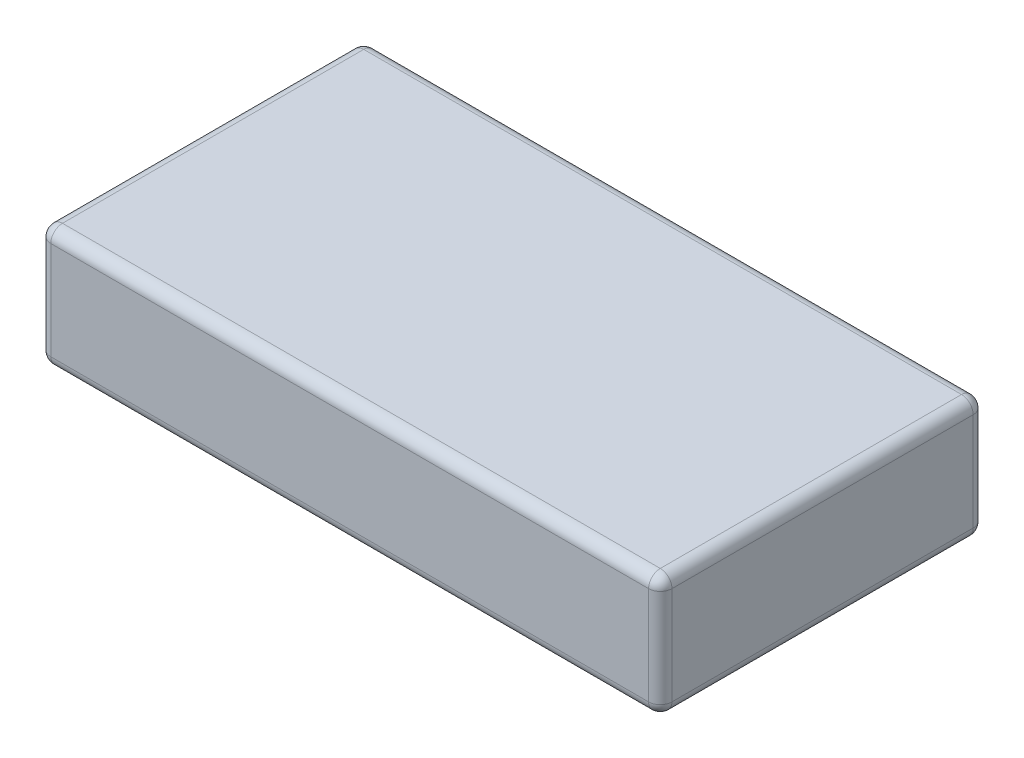
ISO-10303-21;
HEADER;
FILE_DESCRIPTION(('STEP AP214'),'2;1');
FILE_NAME('part.step','',(''),(''),'','','');
FILE_SCHEMA(('AUTOMOTIVE_DESIGN { 1 0 10303 214 1 1 1 1 }'));
ENDSEC;
DATA;
#1=APPLICATION_CONTEXT('core data for automotive mechanical design processes');
#2=APPLICATION_PROTOCOL_DEFINITION('international standard','automotive_design',2000,#1);
#3=PRODUCT_CONTEXT('',#1,'mechanical');
#4=PRODUCT('Part','Part','',(#3));
#5=PRODUCT_RELATED_PRODUCT_CATEGORY('part','',(#4));
#6=PRODUCT_DEFINITION_FORMATION('','',#4);
#7=PRODUCT_DEFINITION_CONTEXT('part definition',#1,'design');
#8=PRODUCT_DEFINITION('design','',#6,#7);
#9=PRODUCT_DEFINITION_SHAPE('','',#8);
#10=(LENGTH_UNIT() NAMED_UNIT(*) SI_UNIT(.MILLI.,.METRE.));
#11=(NAMED_UNIT(*) PLANE_ANGLE_UNIT() SI_UNIT($,.RADIAN.));
#12=(NAMED_UNIT(*) SI_UNIT($,.STERADIAN.) SOLID_ANGLE_UNIT());
#13=UNCERTAINTY_MEASURE_WITH_UNIT(LENGTH_MEASURE(1.E-05),#10,'distance_accuracy_value','');
#14=(GEOMETRIC_REPRESENTATION_CONTEXT(3) GLOBAL_UNCERTAINTY_ASSIGNED_CONTEXT((#13)) GLOBAL_UNIT_ASSIGNED_CONTEXT((#10,
#11,#12)) REPRESENTATION_CONTEXT('',''));
#15=CARTESIAN_POINT('',(0.,0.,0.));
#16=DIRECTION('',(0.,0.,1.));
#17=DIRECTION('',(1.,0.,0.));
#18=AXIS2_PLACEMENT_3D('',#15,#16,#17);
#19=CARTESIAN_POINT('',(26.6,10.4,13.9));
#20=DIRECTION('',(-1.,0.,0.));
#21=DIRECTION('',(0.,0.,1.));
#22=AXIS2_PLACEMENT_3D('',#19,#20,#21);
#23=PLANE('',#22);
#24=DIRECTION('',(0.,0.,-1.));
#25=VECTOR('',#24,1.);
#26=CARTESIAN_POINT('',(26.6,1.,-13.9));
#27=LINE('',#26,#25);
#28=CARTESIAN_POINT('',(26.6,1.,12.9));
#29=VERTEX_POINT('',#28);
#30=CARTESIAN_POINT('',(26.6,1.,-12.9));
#31=VERTEX_POINT('',#30);
#32=EDGE_CURVE('E226',#29,#31,#27,.T.);
#33=ORIENTED_EDGE('',*,*,#32,.T.);
#34=DIRECTION('',(0.,-1.,0.));
#35=VECTOR('',#34,1.);
#36=CARTESIAN_POINT('',(26.6,10.4,-12.9));
#37=LINE('',#36,#35);
#38=CARTESIAN_POINT('',(26.6,9.4,-12.9));
#39=VERTEX_POINT('',#38);
#40=EDGE_CURVE('E230',#31,#39,#37,.F.);
#41=ORIENTED_EDGE('',*,*,#40,.T.);
#42=DIRECTION('',(0.,0.,-1.));
#43=VECTOR('',#42,1.);
#44=CARTESIAN_POINT('',(26.6,9.4,13.9));
#45=LINE('',#44,#43);
#46=CARTESIAN_POINT('',(26.6,9.4,12.9));
#47=VERTEX_POINT('',#46);
#48=EDGE_CURVE('E223',#39,#47,#45,.F.);
#49=ORIENTED_EDGE('',*,*,#48,.T.);
#50=DIRECTION('',(0.,-1.,0.));
#51=VECTOR('',#50,1.);
#52=CARTESIAN_POINT('',(26.6,10.4,12.9));
#53=LINE('',#52,#51);
#54=EDGE_CURVE('E220',#47,#29,#53,.T.);
#55=ORIENTED_EDGE('',*,*,#54,.T.);
#56=EDGE_LOOP('',(#33,#41,#49,#55));
#57=FACE_BOUND('',#56,.T.);
#58=ADVANCED_FACE('F45',(#57),#23,.F.);
#59=CARTESIAN_POINT('',(-26.6,10.4,-13.9));
#60=DIRECTION('',(0.,0.,1.));
#61=DIRECTION('',(1.,0.,0.));
#62=AXIS2_PLACEMENT_3D('',#59,#60,#61);
#63=PLANE('',#62);
#64=DIRECTION('',(-1.,0.,0.));
#65=VECTOR('',#64,1.);
#66=CARTESIAN_POINT('',(-26.6,1.,-13.9));
#67=LINE('',#66,#65);
#68=CARTESIAN_POINT('',(25.6,1.,-13.9));
#69=VERTEX_POINT('',#68);
#70=CARTESIAN_POINT('',(-25.6,1.,-13.9));
#71=VERTEX_POINT('',#70);
#72=EDGE_CURVE('E146',#69,#71,#67,.T.);
#73=ORIENTED_EDGE('',*,*,#72,.T.);
#74=DIRECTION('',(0.,-1.,0.));
#75=VECTOR('',#74,1.);
#76=CARTESIAN_POINT('',(-25.6,10.4,-13.9));
#77=LINE('',#76,#75);
#78=CARTESIAN_POINT('',(-25.6,9.4,-13.9));
#79=VERTEX_POINT('',#78);
#80=EDGE_CURVE('E141',#71,#79,#77,.F.);
#81=ORIENTED_EDGE('',*,*,#80,.T.);
#82=DIRECTION('',(-1.,0.,0.));
#83=VECTOR('',#82,1.);
#84=CARTESIAN_POINT('',(-26.6,9.4,-13.9));
#85=LINE('',#84,#83);
#86=CARTESIAN_POINT('',(25.6,9.4,-13.9));
#87=VERTEX_POINT('',#86);
#88=EDGE_CURVE('E133',#79,#87,#85,.F.);
#89=ORIENTED_EDGE('',*,*,#88,.T.);
#90=DIRECTION('',(0.,-1.,0.));
#91=VECTOR('',#90,1.);
#92=CARTESIAN_POINT('',(25.6,10.4,-13.9));
#93=LINE('',#92,#91);
#94=EDGE_CURVE('E138',#87,#69,#93,.T.);
#95=ORIENTED_EDGE('',*,*,#94,.T.);
#96=EDGE_LOOP('',(#73,#81,#89,#95));
#97=FACE_BOUND('',#96,.T.);
#98=ADVANCED_FACE('F136',(#97),#63,.F.);
#99=CARTESIAN_POINT('',(-26.6,10.4,13.9));
#100=DIRECTION('',(1.,0.,0.));
#101=DIRECTION('',(0.,0.,-1.));
#102=AXIS2_PLACEMENT_3D('',#99,#100,#101);
#103=PLANE('',#102);
#104=DIRECTION('',(0.,0.,1.));
#105=VECTOR('',#104,1.);
#106=CARTESIAN_POINT('',(-26.6,1.,13.9));
#107=LINE('',#106,#105);
#108=CARTESIAN_POINT('',(-26.6,1.,-12.9));
#109=VERTEX_POINT('',#108);
#110=CARTESIAN_POINT('',(-26.6,1.,12.9));
#111=VERTEX_POINT('',#110);
#112=EDGE_CURVE('E200',#109,#111,#107,.T.);
#113=ORIENTED_EDGE('',*,*,#112,.T.);
#114=DIRECTION('',(0.,-1.,0.));
#115=VECTOR('',#114,1.);
#116=CARTESIAN_POINT('',(-26.6,10.4,12.9));
#117=LINE('',#116,#115);
#118=CARTESIAN_POINT('',(-26.6,9.4,12.9));
#119=VERTEX_POINT('',#118);
#120=EDGE_CURVE('E204',#111,#119,#117,.F.);
#121=ORIENTED_EDGE('',*,*,#120,.T.);
#122=DIRECTION('',(0.,0.,1.));
#123=VECTOR('',#122,1.);
#124=CARTESIAN_POINT('',(-26.6,9.4,13.9));
#125=LINE('',#124,#123);
#126=CARTESIAN_POINT('',(-26.6,9.4,-12.9));
#127=VERTEX_POINT('',#126);
#128=EDGE_CURVE('E197',#119,#127,#125,.F.);
#129=ORIENTED_EDGE('',*,*,#128,.T.);
#130=DIRECTION('',(0.,-1.,0.));
#131=VECTOR('',#130,1.);
#132=CARTESIAN_POINT('',(-26.6,10.4,-12.9));
#133=LINE('',#132,#131);
#134=EDGE_CURVE('E194',#127,#109,#133,.T.);
#135=ORIENTED_EDGE('',*,*,#134,.T.);
#136=EDGE_LOOP('',(#113,#121,#129,#135));
#137=FACE_BOUND('',#136,.T.);
#138=ADVANCED_FACE('F323',(#137),#103,.F.);
#139=CARTESIAN_POINT('',(-26.6,10.4,13.9));
#140=DIRECTION('',(0.,0.,-1.));
#141=DIRECTION('',(-1.,0.,0.));
#142=AXIS2_PLACEMENT_3D('',#139,#140,#141);
#143=PLANE('',#142);
#144=DIRECTION('',(1.,0.,0.));
#145=VECTOR('',#144,1.);
#146=CARTESIAN_POINT('',(-26.6,9.4,13.9));
#147=LINE('',#146,#145);
#148=CARTESIAN_POINT('',(25.6,9.4,13.9));
#149=VERTEX_POINT('',#148);
#150=CARTESIAN_POINT('',(-25.6,9.4,13.9));
#151=VERTEX_POINT('',#150);
#152=EDGE_CURVE('E210',#149,#151,#147,.F.);
#153=ORIENTED_EDGE('',*,*,#152,.T.);
#154=DIRECTION('',(0.,-1.,0.));
#155=VECTOR('',#154,1.);
#156=CARTESIAN_POINT('',(-25.6,10.4,13.9));
#157=LINE('',#156,#155);
#158=CARTESIAN_POINT('',(-25.6,1.,13.9));
#159=VERTEX_POINT('',#158);
#160=EDGE_CURVE('E217',#151,#159,#157,.T.);
#161=ORIENTED_EDGE('',*,*,#160,.T.);
#162=DIRECTION('',(1.,0.,0.));
#163=VECTOR('',#162,1.);
#164=CARTESIAN_POINT('',(26.6,1.,13.9));
#165=LINE('',#164,#163);
#166=CARTESIAN_POINT('',(25.6,1.,13.9));
#167=VERTEX_POINT('',#166);
#168=EDGE_CURVE('E213',#159,#167,#165,.T.);
#169=ORIENTED_EDGE('',*,*,#168,.T.);
#170=DIRECTION('',(0.,-1.,0.));
#171=VECTOR('',#170,1.);
#172=CARTESIAN_POINT('',(25.6,10.4,13.9));
#173=LINE('',#172,#171);
#174=EDGE_CURVE('E207',#167,#149,#173,.F.);
#175=ORIENTED_EDGE('',*,*,#174,.T.);
#176=EDGE_LOOP('',(#153,#161,#169,#175));
#177=FACE_BOUND('',#176,.T.);
#178=ADVANCED_FACE('F332',(#177),#143,.F.);
#179=CARTESIAN_POINT('',(0.,10.4,0.));
#180=DIRECTION('',(0.,-1.,0.));
#181=DIRECTION('',(0.,0.,-1.));
#182=AXIS2_PLACEMENT_3D('',#179,#180,#181);
#183=PLANE('',#182);
#184=DIRECTION('',(0.,0.,1.));
#185=VECTOR('',#184,1.);
#186=CARTESIAN_POINT('',(-25.6,10.4,0.));
#187=LINE('',#186,#185);
#188=CARTESIAN_POINT('',(-25.6,10.4,-12.9));
#189=VERTEX_POINT('',#188);
#190=CARTESIAN_POINT('',(-25.6,10.4,12.9));
#191=VERTEX_POINT('',#190);
#192=EDGE_CURVE('E55',#189,#191,#187,.T.);
#193=ORIENTED_EDGE('',*,*,#192,.T.);
#194=DIRECTION('',(1.,0.,0.));
#195=VECTOR('',#194,1.);
#196=CARTESIAN_POINT('',(0.,10.4,12.9));
#197=LINE('',#196,#195);
#198=CARTESIAN_POINT('',(25.6,10.4,12.9));
#199=VERTEX_POINT('',#198);
#200=EDGE_CURVE('E11',#191,#199,#197,.T.);
#201=ORIENTED_EDGE('',*,*,#200,.T.);
#202=DIRECTION('',(0.,0.,-1.));
#203=VECTOR('',#202,1.);
#204=CARTESIAN_POINT('',(25.6,10.4,0.));
#205=LINE('',#204,#203);
#206=CARTESIAN_POINT('',(25.6,10.4,-12.9));
#207=VERTEX_POINT('',#206);
#208=EDGE_CURVE('E233',#199,#207,#205,.T.);
#209=ORIENTED_EDGE('',*,*,#208,.T.);
#210=DIRECTION('',(-1.,0.,0.));
#211=VECTOR('',#210,1.);
#212=CARTESIAN_POINT('',(0.,10.4,-12.9));
#213=LINE('',#212,#211);
#214=EDGE_CURVE('E66',#207,#189,#213,.T.);
#215=ORIENTED_EDGE('',*,*,#214,.T.);
#216=EDGE_LOOP('',(#193,#201,#209,#215));
#217=FACE_BOUND('',#216,.T.);
#218=ADVANCED_FACE('F354',(#217),#183,.F.);
#219=CARTESIAN_POINT('',(0.,0.,0.));
#220=DIRECTION('',(0.,-1.,0.));
#221=DIRECTION('',(0.,0.,-1.));
#222=AXIS2_PLACEMENT_3D('',#219,#220,#221);
#223=PLANE('',#222);
#224=DIRECTION('',(0.,0.,1.));
#225=VECTOR('',#224,1.);
#226=CARTESIAN_POINT('',(-25.6,0.,-13.9));
#227=LINE('',#226,#225);
#228=CARTESIAN_POINT('',(-25.6,0.,12.9));
#229=VERTEX_POINT('',#228);
#230=CARTESIAN_POINT('',(-25.6,0.,-12.9));
#231=VERTEX_POINT('',#230);
#232=EDGE_CURVE('E187',#229,#231,#227,.F.);
#233=ORIENTED_EDGE('',*,*,#232,.T.);
#234=DIRECTION('',(-1.,0.,0.));
#235=VECTOR('',#234,1.);
#236=CARTESIAN_POINT('',(26.6,0.,-12.9));
#237=LINE('',#236,#235);
#238=CARTESIAN_POINT('',(25.6,0.,-12.9));
#239=VERTEX_POINT('',#238);
#240=EDGE_CURVE('E190',#231,#239,#237,.F.);
#241=ORIENTED_EDGE('',*,*,#240,.T.);
#242=DIRECTION('',(0.,0.,-1.));
#243=VECTOR('',#242,1.);
#244=CARTESIAN_POINT('',(25.6,0.,13.9));
#245=LINE('',#244,#243);
#246=CARTESIAN_POINT('',(25.6,0.,12.9));
#247=VERTEX_POINT('',#246);
#248=EDGE_CURVE('E181',#239,#247,#245,.F.);
#249=ORIENTED_EDGE('',*,*,#248,.T.);
#250=DIRECTION('',(1.,0.,0.));
#251=VECTOR('',#250,1.);
#252=CARTESIAN_POINT('',(-26.6,0.,12.9));
#253=LINE('',#252,#251);
#254=EDGE_CURVE('E184',#247,#229,#253,.F.);
#255=ORIENTED_EDGE('',*,*,#254,.T.);
#256=EDGE_LOOP('',(#233,#241,#249,#255));
#257=FACE_BOUND('',#256,.T.);
#258=ADVANCED_FACE('F356',(#257),#223,.T.);
#259=CARTESIAN_POINT('',(0.,9.4,12.9));
#260=DIRECTION('',(1.,0.,0.));
#261=DIRECTION('',(0.,0.,-1.));
#262=AXIS2_PLACEMENT_3D('',#259,#260,#261);
#263=CYLINDRICAL_SURFACE('',#262,1.);
#264=CARTESIAN_POINT('',(25.6,9.4,12.9));
#265=DIRECTION('',(1.,0.,0.));
#266=DIRECTION('',(0.,0.,-1.));
#267=AXIS2_PLACEMENT_3D('',#264,#265,#266);
#268=CIRCLE('',#267,1.);
#269=EDGE_CURVE('E49',#199,#149,#268,.T.);
#270=ORIENTED_EDGE('',*,*,#269,.F.);
#271=ORIENTED_EDGE('',*,*,#200,.F.);
#272=CARTESIAN_POINT('',(-25.6,9.4,12.9));
#273=DIRECTION('',(-1.,0.,0.));
#274=DIRECTION('',(0.,0.,1.));
#275=AXIS2_PLACEMENT_3D('',#272,#273,#274);
#276=CIRCLE('',#275,1.);
#277=EDGE_CURVE('E175',#151,#191,#276,.T.);
#278=ORIENTED_EDGE('',*,*,#277,.F.);
#279=ORIENTED_EDGE('',*,*,#152,.F.);
#280=EDGE_LOOP('',(#270,#271,#278,#279));
#281=FACE_BOUND('',#280,.T.);
#282=ADVANCED_FACE('F47',(#281),#263,.T.);
#283=CARTESIAN_POINT('',(25.6,9.4,12.9));
#284=DIRECTION('',(0.,0.,1.));
#285=DIRECTION('',(1.,0.,0.));
#286=AXIS2_PLACEMENT_3D('',#283,#284,#285);
#287=SPHERICAL_SURFACE('',#286,1.);
#288=CARTESIAN_POINT('',(25.6,9.4,12.9));
#289=DIRECTION('',(0.,0.,1.));
#290=DIRECTION('',(1.,0.,0.));
#291=AXIS2_PLACEMENT_3D('',#288,#289,#290);
#292=CIRCLE('',#291,1.);
#293=EDGE_CURVE('E300',#199,#47,#292,.F.);
#294=ORIENTED_EDGE('',*,*,#293,.F.);
#295=ORIENTED_EDGE('',*,*,#269,.T.);
#296=CARTESIAN_POINT('',(25.6,9.4,12.9));
#297=DIRECTION('',(0.,1.,0.));
#298=DIRECTION('',(0.,0.,1.));
#299=AXIS2_PLACEMENT_3D('',#296,#297,#298);
#300=CIRCLE('',#299,1.);
#301=EDGE_CURVE('E304',#47,#149,#300,.F.);
#302=ORIENTED_EDGE('',*,*,#301,.F.);
#303=EDGE_LOOP('',(#294,#295,#302));
#304=FACE_BOUND('',#303,.T.);
#305=ADVANCED_FACE('F350',(#304),#287,.T.);
#306=CARTESIAN_POINT('',(-25.6,9.4,12.9));
#307=DIRECTION('',(0.,1.,0.));
#308=DIRECTION('',(0.,0.,1.));
#309=AXIS2_PLACEMENT_3D('',#306,#307,#308);
#310=SPHERICAL_SURFACE('',#309,1.);
#311=CARTESIAN_POINT('',(-25.6,9.4,12.9));
#312=DIRECTION('',(0.,1.,0.));
#313=DIRECTION('',(0.,0.,1.));
#314=AXIS2_PLACEMENT_3D('',#311,#312,#313);
#315=CIRCLE('',#314,1.);
#316=EDGE_CURVE('E292',#151,#119,#315,.F.);
#317=ORIENTED_EDGE('',*,*,#316,.F.);
#318=ORIENTED_EDGE('',*,*,#277,.T.);
#319=CARTESIAN_POINT('',(-25.6,9.4,12.9));
#320=DIRECTION('',(0.,0.,1.));
#321=DIRECTION('',(1.,0.,0.));
#322=AXIS2_PLACEMENT_3D('',#319,#320,#321);
#323=CIRCLE('',#322,1.);
#324=EDGE_CURVE('E296',#119,#191,#323,.F.);
#325=ORIENTED_EDGE('',*,*,#324,.F.);
#326=EDGE_LOOP('',(#317,#318,#325));
#327=FACE_BOUND('',#326,.T.);
#328=ADVANCED_FACE('F313',(#327),#310,.T.);
#329=CARTESIAN_POINT('',(25.6,10.4,12.9));
#330=DIRECTION('',(0.,-1.,0.));
#331=DIRECTION('',(0.,0.,-1.));
#332=AXIS2_PLACEMENT_3D('',#329,#330,#331);
#333=CYLINDRICAL_SURFACE('',#332,1.);
#334=ORIENTED_EDGE('',*,*,#301,.T.);
#335=ORIENTED_EDGE('',*,*,#174,.F.);
#336=CARTESIAN_POINT('',(25.6,1.,12.9));
#337=DIRECTION('',(0.,-1.,0.));
#338=DIRECTION('',(0.,0.,-1.));
#339=AXIS2_PLACEMENT_3D('',#336,#337,#338);
#340=CIRCLE('',#339,1.);
#341=EDGE_CURVE('E285',#29,#167,#340,.T.);
#342=ORIENTED_EDGE('',*,*,#341,.F.);
#343=ORIENTED_EDGE('',*,*,#54,.F.);
#344=EDGE_LOOP('',(#334,#335,#342,#343));
#345=FACE_BOUND('',#344,.T.);
#346=ADVANCED_FACE('F344',(#345),#333,.T.);
#347=CARTESIAN_POINT('',(25.6,9.4,0.));
#348=DIRECTION('',(0.,0.,-1.));
#349=DIRECTION('',(-1.,0.,0.));
#350=AXIS2_PLACEMENT_3D('',#347,#348,#349);
#351=CYLINDRICAL_SURFACE('',#350,1.);
#352=ORIENTED_EDGE('',*,*,#293,.T.);
#353=ORIENTED_EDGE('',*,*,#48,.F.);
#354=CARTESIAN_POINT('',(25.6,9.4,-12.9));
#355=DIRECTION('',(0.,0.,-1.));
#356=DIRECTION('',(-1.,0.,0.));
#357=AXIS2_PLACEMENT_3D('',#354,#355,#356);
#358=CIRCLE('',#357,1.);
#359=EDGE_CURVE('E156',#207,#39,#358,.T.);
#360=ORIENTED_EDGE('',*,*,#359,.F.);
#361=ORIENTED_EDGE('',*,*,#208,.F.);
#362=EDGE_LOOP('',(#352,#353,#360,#361));
#363=FACE_BOUND('',#362,.T.);
#364=ADVANCED_FACE('F353',(#363),#351,.T.);
#365=CARTESIAN_POINT('',(0.,9.4,-12.9));
#366=DIRECTION('',(-1.,0.,0.));
#367=DIRECTION('',(0.,0.,1.));
#368=AXIS2_PLACEMENT_3D('',#365,#366,#367);
#369=CYLINDRICAL_SURFACE('',#368,1.);
#370=CARTESIAN_POINT('',(-25.6,9.4,-12.9));
#371=DIRECTION('',(-1.,0.,0.));
#372=DIRECTION('',(0.,0.,1.));
#373=AXIS2_PLACEMENT_3D('',#370,#371,#372);
#374=CIRCLE('',#373,1.);
#375=EDGE_CURVE('E157',#189,#79,#374,.T.);
#376=ORIENTED_EDGE('',*,*,#375,.F.);
#377=ORIENTED_EDGE('',*,*,#214,.F.);
#378=CARTESIAN_POINT('',(25.6,9.4,-12.9));
#379=DIRECTION('',(1.,0.,0.));
#380=DIRECTION('',(0.,0.,-1.));
#381=AXIS2_PLACEMENT_3D('',#378,#379,#380);
#382=CIRCLE('',#381,1.);
#383=EDGE_CURVE('E149',#87,#207,#382,.T.);
#384=ORIENTED_EDGE('',*,*,#383,.F.);
#385=ORIENTED_EDGE('',*,*,#88,.F.);
#386=EDGE_LOOP('',(#376,#377,#384,#385));
#387=FACE_BOUND('',#386,.T.);
#388=ADVANCED_FACE('F151',(#387),#369,.T.);
#389=CARTESIAN_POINT('',(-25.6,9.4,0.));
#390=DIRECTION('',(0.,0.,1.));
#391=DIRECTION('',(1.,0.,0.));
#392=AXIS2_PLACEMENT_3D('',#389,#390,#391);
#393=CYLINDRICAL_SURFACE('',#392,1.);
#394=ORIENTED_EDGE('',*,*,#324,.T.);
#395=ORIENTED_EDGE('',*,*,#192,.F.);
#396=CARTESIAN_POINT('',(-25.6,9.4,-12.9));
#397=DIRECTION('',(0.,0.,-1.));
#398=DIRECTION('',(-1.,0.,0.));
#399=AXIS2_PLACEMENT_3D('',#396,#397,#398);
#400=CIRCLE('',#399,1.);
#401=EDGE_CURVE('E277',#127,#189,#400,.T.);
#402=ORIENTED_EDGE('',*,*,#401,.F.);
#403=ORIENTED_EDGE('',*,*,#128,.F.);
#404=EDGE_LOOP('',(#394,#395,#402,#403));
#405=FACE_BOUND('',#404,.T.);
#406=ADVANCED_FACE('F319',(#405),#393,.T.);
#407=CARTESIAN_POINT('',(-25.6,10.4,12.9));
#408=DIRECTION('',(0.,-1.,0.));
#409=DIRECTION('',(0.,0.,-1.));
#410=AXIS2_PLACEMENT_3D('',#407,#408,#409);
#411=CYLINDRICAL_SURFACE('',#410,1.);
#412=ORIENTED_EDGE('',*,*,#316,.T.);
#413=ORIENTED_EDGE('',*,*,#120,.F.);
#414=CARTESIAN_POINT('',(-25.6,1.,12.9));
#415=DIRECTION('',(0.,-1.,0.));
#416=DIRECTION('',(0.,0.,-1.));
#417=AXIS2_PLACEMENT_3D('',#414,#415,#416);
#418=CIRCLE('',#417,1.);
#419=EDGE_CURVE('E273',#159,#111,#418,.T.);
#420=ORIENTED_EDGE('',*,*,#419,.F.);
#421=ORIENTED_EDGE('',*,*,#160,.F.);
#422=EDGE_LOOP('',(#412,#413,#420,#421));
#423=FACE_BOUND('',#422,.T.);
#424=ADVANCED_FACE('F329',(#423),#411,.T.);
#425=CARTESIAN_POINT('',(-26.6,1.,12.9));
#426=DIRECTION('',(-1.,0.,0.));
#427=DIRECTION('',(0.,0.,1.));
#428=AXIS2_PLACEMENT_3D('',#425,#426,#427);
#429=CYLINDRICAL_SURFACE('',#428,1.);
#430=CARTESIAN_POINT('',(25.6,1.,12.9));
#431=DIRECTION('',(1.,0.,0.));
#432=DIRECTION('',(0.,0.,-1.));
#433=AXIS2_PLACEMENT_3D('',#430,#431,#432);
#434=CIRCLE('',#433,1.);
#435=EDGE_CURVE('E288',#167,#247,#434,.T.);
#436=ORIENTED_EDGE('',*,*,#435,.F.);
#437=ORIENTED_EDGE('',*,*,#168,.F.);
#438=CARTESIAN_POINT('',(-25.6,1.,12.9));
#439=DIRECTION('',(-1.,0.,0.));
#440=DIRECTION('',(0.,0.,1.));
#441=AXIS2_PLACEMENT_3D('',#438,#439,#440);
#442=CIRCLE('',#441,1.);
#443=EDGE_CURVE('E269',#229,#159,#442,.T.);
#444=ORIENTED_EDGE('',*,*,#443,.F.);
#445=ORIENTED_EDGE('',*,*,#254,.F.);
#446=EDGE_LOOP('',(#436,#437,#444,#445));
#447=FACE_BOUND('',#446,.T.);
#448=ADVANCED_FACE('F336',(#447),#429,.T.);
#449=CARTESIAN_POINT('',(25.6,1.,12.9));
#450=DIRECTION('',(0.,0.,1.));
#451=DIRECTION('',(0.,-1.,0.));
#452=AXIS2_PLACEMENT_3D('',#449,#450,#451);
#453=SPHERICAL_SURFACE('',#452,1.);
#454=ORIENTED_EDGE('',*,*,#341,.T.);
#455=ORIENTED_EDGE('',*,*,#435,.T.);
#456=CARTESIAN_POINT('',(25.6,1.,12.9));
#457=DIRECTION('',(0.,0.,1.));
#458=DIRECTION('',(1.,0.,0.));
#459=AXIS2_PLACEMENT_3D('',#456,#457,#458);
#460=CIRCLE('',#459,1.);
#461=EDGE_CURVE('E165',#29,#247,#460,.F.);
#462=ORIENTED_EDGE('',*,*,#461,.F.);
#463=EDGE_LOOP('',(#454,#455,#462));
#464=FACE_BOUND('',#463,.T.);
#465=ADVANCED_FACE('F410',(#464),#453,.T.);
#466=CARTESIAN_POINT('',(25.6,9.4,-12.9));
#467=DIRECTION('',(0.,1.,0.));
#468=DIRECTION('',(0.,0.,1.));
#469=AXIS2_PLACEMENT_3D('',#466,#467,#468);
#470=SPHERICAL_SURFACE('',#469,1.);
#471=ORIENTED_EDGE('',*,*,#383,.T.);
#472=ORIENTED_EDGE('',*,*,#359,.T.);
#473=CARTESIAN_POINT('',(25.6,9.4,-12.9));
#474=DIRECTION('',(0.,1.,0.));
#475=DIRECTION('',(0.,0.,1.));
#476=AXIS2_PLACEMENT_3D('',#473,#474,#475);
#477=CIRCLE('',#476,1.);
#478=EDGE_CURVE('E160',#87,#39,#477,.F.);
#479=ORIENTED_EDGE('',*,*,#478,.F.);
#480=EDGE_LOOP('',(#471,#472,#479));
#481=FACE_BOUND('',#480,.T.);
#482=ADVANCED_FACE('F161',(#481),#470,.T.);
#483=CARTESIAN_POINT('',(-25.6,9.4,-12.9));
#484=DIRECTION('',(0.,1.,0.));
#485=DIRECTION('',(0.,0.,1.));
#486=AXIS2_PLACEMENT_3D('',#483,#484,#485);
#487=SPHERICAL_SURFACE('',#486,1.);
#488=ORIENTED_EDGE('',*,*,#401,.T.);
#489=ORIENTED_EDGE('',*,*,#375,.T.);
#490=CARTESIAN_POINT('',(-25.6,9.4,-12.9));
#491=DIRECTION('',(0.,1.,0.));
#492=DIRECTION('',(0.,0.,1.));
#493=AXIS2_PLACEMENT_3D('',#490,#491,#492);
#494=CIRCLE('',#493,1.);
#495=EDGE_CURVE('E166',#127,#79,#494,.F.);
#496=ORIENTED_EDGE('',*,*,#495,.F.);
#497=EDGE_LOOP('',(#488,#489,#496));
#498=FACE_BOUND('',#497,.T.);
#499=ADVANCED_FACE('F403',(#498),#487,.T.);
#500=CARTESIAN_POINT('',(-25.6,1.,12.9));
#501=DIRECTION('',(0.,0.,1.));
#502=DIRECTION('',(0.,-1.,0.));
#503=AXIS2_PLACEMENT_3D('',#500,#501,#502);
#504=SPHERICAL_SURFACE('',#503,1.);
#505=ORIENTED_EDGE('',*,*,#443,.T.);
#506=ORIENTED_EDGE('',*,*,#419,.T.);
#507=CARTESIAN_POINT('',(-25.6,1.,12.9));
#508=DIRECTION('',(0.,0.,1.));
#509=DIRECTION('',(1.,0.,0.));
#510=AXIS2_PLACEMENT_3D('',#507,#508,#509);
#511=CIRCLE('',#510,1.);
#512=EDGE_CURVE('E260',#229,#111,#511,.F.);
#513=ORIENTED_EDGE('',*,*,#512,.F.);
#514=EDGE_LOOP('',(#505,#506,#513));
#515=FACE_BOUND('',#514,.T.);
#516=ADVANCED_FACE('F399',(#515),#504,.T.);
#517=CARTESIAN_POINT('',(25.6,1.,13.9));
#518=DIRECTION('',(0.,0.,1.));
#519=DIRECTION('',(1.,0.,0.));
#520=AXIS2_PLACEMENT_3D('',#517,#518,#519);
#521=CYLINDRICAL_SURFACE('',#520,1.);
#522=ORIENTED_EDGE('',*,*,#461,.T.);
#523=ORIENTED_EDGE('',*,*,#248,.F.);
#524=CARTESIAN_POINT('',(25.6,1.,-12.9));
#525=DIRECTION('',(0.,0.,-1.));
#526=DIRECTION('',(-1.,0.,0.));
#527=AXIS2_PLACEMENT_3D('',#524,#525,#526);
#528=CIRCLE('',#527,1.);
#529=EDGE_CURVE('E256',#31,#239,#528,.T.);
#530=ORIENTED_EDGE('',*,*,#529,.F.);
#531=ORIENTED_EDGE('',*,*,#32,.F.);
#532=EDGE_LOOP('',(#522,#523,#530,#531));
#533=FACE_BOUND('',#532,.T.);
#534=ADVANCED_FACE('F396',(#533),#521,.T.);
#535=CARTESIAN_POINT('',(25.6,10.4,-12.9));
#536=DIRECTION('',(0.,-1.,0.));
#537=DIRECTION('',(0.,0.,-1.));
#538=AXIS2_PLACEMENT_3D('',#535,#536,#537);
#539=CYLINDRICAL_SURFACE('',#538,1.);
#540=ORIENTED_EDGE('',*,*,#478,.T.);
#541=ORIENTED_EDGE('',*,*,#40,.F.);
#542=CARTESIAN_POINT('',(25.6,1.,-12.9));
#543=DIRECTION('',(0.,-1.,0.));
#544=DIRECTION('',(0.,0.,-1.));
#545=AXIS2_PLACEMENT_3D('',#542,#543,#544);
#546=CIRCLE('',#545,1.);
#547=EDGE_CURVE('E169',#69,#31,#546,.T.);
#548=ORIENTED_EDGE('',*,*,#547,.F.);
#549=ORIENTED_EDGE('',*,*,#94,.F.);
#550=EDGE_LOOP('',(#540,#541,#548,#549));
#551=FACE_BOUND('',#550,.T.);
#552=ADVANCED_FACE('F168',(#551),#539,.T.);
#553=CARTESIAN_POINT('',(-25.6,10.4,-12.9));
#554=DIRECTION('',(0.,-1.,0.));
#555=DIRECTION('',(0.,0.,-1.));
#556=AXIS2_PLACEMENT_3D('',#553,#554,#555);
#557=CYLINDRICAL_SURFACE('',#556,1.);
#558=ORIENTED_EDGE('',*,*,#495,.T.);
#559=ORIENTED_EDGE('',*,*,#80,.F.);
#560=CARTESIAN_POINT('',(-25.6,1.,-12.9));
#561=DIRECTION('',(0.,-1.,0.));
#562=DIRECTION('',(0.,0.,-1.));
#563=AXIS2_PLACEMENT_3D('',#560,#561,#562);
#564=CIRCLE('',#563,1.);
#565=EDGE_CURVE('E250',#109,#71,#564,.T.);
#566=ORIENTED_EDGE('',*,*,#565,.F.);
#567=ORIENTED_EDGE('',*,*,#134,.F.);
#568=EDGE_LOOP('',(#558,#559,#566,#567));
#569=FACE_BOUND('',#568,.T.);
#570=ADVANCED_FACE('F389',(#569),#557,.T.);
#571=CARTESIAN_POINT('',(-25.6,1.,13.9));
#572=DIRECTION('',(0.,0.,-1.));
#573=DIRECTION('',(-1.,0.,0.));
#574=AXIS2_PLACEMENT_3D('',#571,#572,#573);
#575=CYLINDRICAL_SURFACE('',#574,1.);
#576=ORIENTED_EDGE('',*,*,#512,.T.);
#577=ORIENTED_EDGE('',*,*,#112,.F.);
#578=CARTESIAN_POINT('',(-25.6,1.,-12.9));
#579=DIRECTION('',(0.,0.,-1.));
#580=DIRECTION('',(-1.,0.,0.));
#581=AXIS2_PLACEMENT_3D('',#578,#579,#580);
#582=CIRCLE('',#581,1.);
#583=EDGE_CURVE('E246',#231,#109,#582,.T.);
#584=ORIENTED_EDGE('',*,*,#583,.F.);
#585=ORIENTED_EDGE('',*,*,#232,.F.);
#586=EDGE_LOOP('',(#576,#577,#584,#585));
#587=FACE_BOUND('',#586,.T.);
#588=ADVANCED_FACE('F385',(#587),#575,.T.);
#589=CARTESIAN_POINT('',(25.6,1.,-12.9));
#590=DIRECTION('',(1.,0.,0.));
#591=DIRECTION('',(0.,1.,0.));
#592=AXIS2_PLACEMENT_3D('',#589,#590,#591);
#593=SPHERICAL_SURFACE('',#592,1.);
#594=ORIENTED_EDGE('',*,*,#547,.T.);
#595=ORIENTED_EDGE('',*,*,#529,.T.);
#596=CARTESIAN_POINT('',(25.6,1.,-12.9));
#597=DIRECTION('',(1.,0.,0.));
#598=DIRECTION('',(0.,0.,-1.));
#599=AXIS2_PLACEMENT_3D('',#596,#597,#598);
#600=CIRCLE('',#599,1.);
#601=EDGE_CURVE('E243',#69,#239,#600,.F.);
#602=ORIENTED_EDGE('',*,*,#601,.F.);
#603=EDGE_LOOP('',(#594,#595,#602));
#604=FACE_BOUND('',#603,.T.);
#605=ADVANCED_FACE('F381',(#604),#593,.T.);
#606=CARTESIAN_POINT('',(-25.6,1.,-12.9));
#607=DIRECTION('',(-1.,0.,0.));
#608=DIRECTION('',(0.,-1.,0.));
#609=AXIS2_PLACEMENT_3D('',#606,#607,#608);
#610=SPHERICAL_SURFACE('',#609,1.);
#611=ORIENTED_EDGE('',*,*,#583,.T.);
#612=ORIENTED_EDGE('',*,*,#565,.T.);
#613=CARTESIAN_POINT('',(-25.6,1.,-12.9));
#614=DIRECTION('',(-1.,0.,0.));
#615=DIRECTION('',(0.,0.,1.));
#616=AXIS2_PLACEMENT_3D('',#613,#614,#615);
#617=CIRCLE('',#616,1.);
#618=EDGE_CURVE('E240',#231,#71,#617,.F.);
#619=ORIENTED_EDGE('',*,*,#618,.F.);
#620=EDGE_LOOP('',(#611,#612,#619));
#621=FACE_BOUND('',#620,.T.);
#622=ADVANCED_FACE('F377',(#621),#610,.T.);
#623=CARTESIAN_POINT('',(-26.6,1.,-12.9));
#624=DIRECTION('',(1.,0.,0.));
#625=DIRECTION('',(0.,0.,-1.));
#626=AXIS2_PLACEMENT_3D('',#623,#624,#625);
#627=CYLINDRICAL_SURFACE('',#626,1.);
#628=ORIENTED_EDGE('',*,*,#601,.T.);
#629=ORIENTED_EDGE('',*,*,#240,.F.);
#630=ORIENTED_EDGE('',*,*,#618,.T.);
#631=ORIENTED_EDGE('',*,*,#72,.F.);
#632=EDGE_LOOP('',(#628,#629,#630,#631));
#633=FACE_BOUND('',#632,.T.);
#634=ADVANCED_FACE('F374',(#633),#627,.T.);
#635=CLOSED_SHELL('',(#58,#98,#138,#178,#218,#258,#282,#305,#328,#346,#364,#388,#406,#424,#448,
#465,#482,#499,#516,#534,#552,#570,#588,#605,#622,#634));
#636=MANIFOLD_SOLID_BREP('B2',#635);
#637=ADVANCED_BREP_SHAPE_REPRESENTATION('',(#18,#636),#14);
#638=SHAPE_DEFINITION_REPRESENTATION(#9,#637);
ENDSEC;
END-ISO-10303-21;
